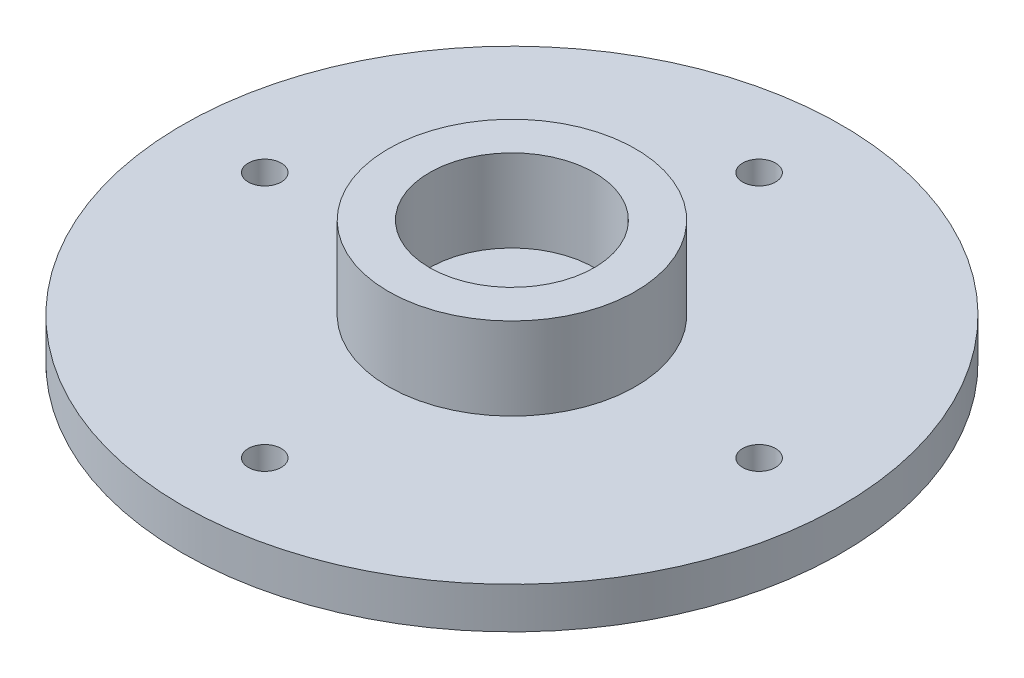
ISO-10303-21;
HEADER;
FILE_DESCRIPTION(('STEP AP214'),'2;1');
FILE_NAME('part.step','',(''),(''),'','','');
FILE_SCHEMA(('AUTOMOTIVE_DESIGN { 1 0 10303 214 1 1 1 1 }'));
ENDSEC;
DATA;
#1=APPLICATION_CONTEXT('core data for automotive mechanical design processes');
#2=APPLICATION_PROTOCOL_DEFINITION('international standard','automotive_design',2000,#1);
#3=PRODUCT_CONTEXT('',#1,'mechanical');
#4=PRODUCT('Part','Part','',(#3));
#5=PRODUCT_RELATED_PRODUCT_CATEGORY('part','',(#4));
#6=PRODUCT_DEFINITION_FORMATION('','',#4);
#7=PRODUCT_DEFINITION_CONTEXT('part definition',#1,'design');
#8=PRODUCT_DEFINITION('design','',#6,#7);
#9=PRODUCT_DEFINITION_SHAPE('','',#8);
#10=(LENGTH_UNIT() NAMED_UNIT(*) SI_UNIT(.MILLI.,.METRE.));
#11=(NAMED_UNIT(*) PLANE_ANGLE_UNIT() SI_UNIT($,.RADIAN.));
#12=(NAMED_UNIT(*) SI_UNIT($,.STERADIAN.) SOLID_ANGLE_UNIT());
#13=UNCERTAINTY_MEASURE_WITH_UNIT(LENGTH_MEASURE(1.E-05),#10,'distance_accuracy_value','');
#14=(GEOMETRIC_REPRESENTATION_CONTEXT(3) GLOBAL_UNCERTAINTY_ASSIGNED_CONTEXT((#13)) GLOBAL_UNIT_ASSIGNED_CONTEXT((#10,
#11,#12)) REPRESENTATION_CONTEXT('',''));
#15=CARTESIAN_POINT('',(0.,0.,0.));
#16=DIRECTION('',(0.,0.,1.));
#17=DIRECTION('',(1.,0.,0.));
#18=AXIS2_PLACEMENT_3D('',#15,#16,#17);
#19=CARTESIAN_POINT('',(0.,2.5,0.));
#20=DIRECTION('',(0.,1.,0.));
#21=DIRECTION('',(0.,0.,1.));
#22=AXIS2_PLACEMENT_3D('',#19,#20,#21);
#23=PLANE('',#22);
#24=CARTESIAN_POINT('',(0.,2.5,0.));
#25=DIRECTION('',(0.,1.,0.));
#26=DIRECTION('',(0.,0.,1.));
#27=AXIS2_PLACEMENT_3D('',#24,#25,#26);
#28=CIRCLE('',#27,15.);
#29=CARTESIAN_POINT('',(0.,2.5,15.));
#30=VERTEX_POINT('',#29);
#31=EDGE_CURVE('E85',#30,#30,#28,.T.);
#32=ORIENTED_EDGE('',*,*,#31,.F.);
#33=EDGE_LOOP('',(#32));
#34=FACE_BOUND('',#33,.T.);
#35=CARTESIAN_POINT('',(1.69428074463191E-12,2.5,30.));
#36=DIRECTION('',(0.,1.,0.));
#37=DIRECTION('',(0.,0.,1.));
#38=AXIS2_PLACEMENT_3D('',#35,#36,#37);
#39=CIRCLE('',#38,2.00000000000182);
#40=CARTESIAN_POINT('',(1.69428074463191E-12,2.5,32.0000000000018));
#41=VERTEX_POINT('',#40);
#42=EDGE_CURVE('E70',#41,#41,#39,.T.);
#43=ORIENTED_EDGE('',*,*,#42,.F.);
#44=EDGE_LOOP('',(#43));
#45=FACE_BOUND('',#44,.T.);
#46=CARTESIAN_POINT('',(0.,2.5,-30.));
#47=DIRECTION('',(0.,1.,0.));
#48=DIRECTION('',(0.,0.,1.));
#49=AXIS2_PLACEMENT_3D('',#46,#47,#48);
#50=CIRCLE('',#49,2.);
#51=CARTESIAN_POINT('',(0.,2.5,-28.));
#52=VERTEX_POINT('',#51);
#53=EDGE_CURVE('E59',#52,#52,#50,.T.);
#54=ORIENTED_EDGE('',*,*,#53,.F.);
#55=EDGE_LOOP('',(#54));
#56=FACE_BOUND('',#55,.T.);
#57=CARTESIAN_POINT('',(0.,2.5,0.));
#58=DIRECTION('',(0.,1.,0.));
#59=DIRECTION('',(0.,0.,1.));
#60=AXIS2_PLACEMENT_3D('',#57,#58,#59);
#61=CIRCLE('',#60,40.);
#62=CARTESIAN_POINT('',(0.,2.5,40.));
#63=VERTEX_POINT('',#62);
#64=EDGE_CURVE('E50',#63,#63,#61,.T.);
#65=ORIENTED_EDGE('',*,*,#64,.T.);
#66=EDGE_LOOP('',(#65));
#67=FACE_BOUND('',#66,.T.);
#68=CARTESIAN_POINT('',(30.0000000000008,2.5,-8.47140372315957E-13));
#69=DIRECTION('',(0.,1.,0.));
#70=DIRECTION('',(0.,0.,1.));
#71=AXIS2_PLACEMENT_3D('',#68,#69,#70);
#72=CIRCLE('',#71,2.00000000000066);
#73=CARTESIAN_POINT('',(30.0000000000008,2.5,1.99999999999982));
#74=VERTEX_POINT('',#73);
#75=EDGE_CURVE('E64',#74,#74,#72,.T.);
#76=ORIENTED_EDGE('',*,*,#75,.F.);
#77=EDGE_LOOP('',(#76));
#78=FACE_BOUND('',#77,.T.);
#79=CARTESIAN_POINT('',(-29.9999999999992,2.5,8.43466431918515E-13));
#80=DIRECTION('',(0.,1.,0.));
#81=DIRECTION('',(0.,0.,1.));
#82=AXIS2_PLACEMENT_3D('',#79,#80,#81);
#83=CIRCLE('',#82,2.00000000000135);
#84=CARTESIAN_POINT('',(-29.9999999999992,2.5,2.0000000000022));
#85=VERTEX_POINT('',#84);
#86=EDGE_CURVE('E76',#85,#85,#83,.T.);
#87=ORIENTED_EDGE('',*,*,#86,.F.);
#88=EDGE_LOOP('',(#87));
#89=FACE_BOUND('',#88,.T.);
#90=ADVANCED_FACE('F43',(#34,#45,#56,#67,#78,#89),#23,.T.);
#91=CARTESIAN_POINT('',(0.,-2.5,0.));
#92=DIRECTION('',(0.,1.,0.));
#93=DIRECTION('',(0.,0.,1.));
#94=AXIS2_PLACEMENT_3D('',#91,#92,#93);
#95=PLANE('',#94);
#96=CARTESIAN_POINT('',(0.,-2.5,0.));
#97=DIRECTION('',(0.,1.,0.));
#98=DIRECTION('',(0.,0.,1.));
#99=AXIS2_PLACEMENT_3D('',#96,#97,#98);
#100=CIRCLE('',#99,40.);
#101=CARTESIAN_POINT('',(0.,-2.5,40.));
#102=VERTEX_POINT('',#101);
#103=EDGE_CURVE('E54',#102,#102,#100,.T.);
#104=ORIENTED_EDGE('',*,*,#103,.F.);
#105=EDGE_LOOP('',(#104));
#106=FACE_BOUND('',#105,.T.);
#107=CARTESIAN_POINT('',(0.,-2.5,-30.));
#108=DIRECTION('',(0.,1.,0.));
#109=DIRECTION('',(0.,0.,1.));
#110=AXIS2_PLACEMENT_3D('',#107,#108,#109);
#111=CIRCLE('',#110,2.);
#112=CARTESIAN_POINT('',(0.,-2.5,-28.));
#113=VERTEX_POINT('',#112);
#114=EDGE_CURVE('E61',#113,#113,#111,.T.);
#115=ORIENTED_EDGE('',*,*,#114,.T.);
#116=EDGE_LOOP('',(#115));
#117=FACE_BOUND('',#116,.T.);
#118=CARTESIAN_POINT('',(30.0000000000008,-2.5,-8.47140372315957E-13));
#119=DIRECTION('',(0.,1.,0.));
#120=DIRECTION('',(0.,0.,1.));
#121=AXIS2_PLACEMENT_3D('',#118,#119,#120);
#122=CIRCLE('',#121,2.00000000000066);
#123=CARTESIAN_POINT('',(30.0000000000008,-2.5,1.99999999999982));
#124=VERTEX_POINT('',#123);
#125=EDGE_CURVE('E67',#124,#124,#122,.T.);
#126=ORIENTED_EDGE('',*,*,#125,.T.);
#127=EDGE_LOOP('',(#126));
#128=FACE_BOUND('',#127,.T.);
#129=CARTESIAN_POINT('',(1.69428074463191E-12,-2.5,30.));
#130=DIRECTION('',(0.,1.,0.));
#131=DIRECTION('',(0.,0.,1.));
#132=AXIS2_PLACEMENT_3D('',#129,#130,#131);
#133=CIRCLE('',#132,2.00000000000182);
#134=CARTESIAN_POINT('',(1.69428074463191E-12,-2.5,32.0000000000018));
#135=VERTEX_POINT('',#134);
#136=EDGE_CURVE('E73',#135,#135,#133,.T.);
#137=ORIENTED_EDGE('',*,*,#136,.T.);
#138=EDGE_LOOP('',(#137));
#139=FACE_BOUND('',#138,.T.);
#140=CARTESIAN_POINT('',(-29.9999999999992,-2.5,8.43466431918515E-13));
#141=DIRECTION('',(0.,1.,0.));
#142=DIRECTION('',(0.,0.,1.));
#143=AXIS2_PLACEMENT_3D('',#140,#141,#142);
#144=CIRCLE('',#143,2.00000000000135);
#145=CARTESIAN_POINT('',(-29.9999999999992,-2.5,2.0000000000022));
#146=VERTEX_POINT('',#145);
#147=EDGE_CURVE('E79',#146,#146,#144,.T.);
#148=ORIENTED_EDGE('',*,*,#147,.T.);
#149=EDGE_LOOP('',(#148));
#150=FACE_BOUND('',#149,.T.);
#151=ADVANCED_FACE('F113',(#106,#117,#128,#139,#150),#95,.F.);
#152=CARTESIAN_POINT('',(0.,2.5,0.));
#153=DIRECTION('',(0.,-1.,0.));
#154=DIRECTION('',(0.,0.,-1.));
#155=AXIS2_PLACEMENT_3D('',#152,#153,#154);
#156=CYLINDRICAL_SURFACE('',#155,40.);
#157=ORIENTED_EDGE('',*,*,#64,.F.);
#158=EDGE_LOOP('',(#157));
#159=FACE_BOUND('',#158,.T.);
#160=ORIENTED_EDGE('',*,*,#103,.T.);
#161=EDGE_LOOP('',(#160));
#162=FACE_BOUND('',#161,.T.);
#163=ADVANCED_FACE('F45',(#159,#162),#156,.T.);
#164=CARTESIAN_POINT('',(0.,2.5,-30.));
#165=DIRECTION('',(0.,-1.,0.));
#166=DIRECTION('',(0.,0.,-1.));
#167=AXIS2_PLACEMENT_3D('',#164,#165,#166);
#168=CYLINDRICAL_SURFACE('',#167,2.);
#169=ORIENTED_EDGE('',*,*,#53,.T.);
#170=EDGE_LOOP('',(#169));
#171=FACE_BOUND('',#170,.T.);
#172=ORIENTED_EDGE('',*,*,#114,.F.);
#173=EDGE_LOOP('',(#172));
#174=FACE_BOUND('',#173,.T.);
#175=ADVANCED_FACE('F170',(#171,#174),#168,.F.);
#176=CARTESIAN_POINT('',(30.0000000000008,2.5,-8.47140372315957E-13));
#177=DIRECTION('',(0.,-1.,0.));
#178=DIRECTION('',(0.,0.,-1.));
#179=AXIS2_PLACEMENT_3D('',#176,#177,#178);
#180=CYLINDRICAL_SURFACE('',#179,2.00000000000066);
#181=ORIENTED_EDGE('',*,*,#75,.T.);
#182=EDGE_LOOP('',(#181));
#183=FACE_BOUND('',#182,.T.);
#184=ORIENTED_EDGE('',*,*,#125,.F.);
#185=EDGE_LOOP('',(#184));
#186=FACE_BOUND('',#185,.T.);
#187=ADVANCED_FACE('F160',(#183,#186),#180,.F.);
#188=CARTESIAN_POINT('',(1.69428074463191E-12,2.5,30.));
#189=DIRECTION('',(0.,-1.,0.));
#190=DIRECTION('',(0.,0.,-1.));
#191=AXIS2_PLACEMENT_3D('',#188,#189,#190);
#192=CYLINDRICAL_SURFACE('',#191,2.00000000000182);
#193=ORIENTED_EDGE('',*,*,#42,.T.);
#194=EDGE_LOOP('',(#193));
#195=FACE_BOUND('',#194,.T.);
#196=ORIENTED_EDGE('',*,*,#136,.F.);
#197=EDGE_LOOP('',(#196));
#198=FACE_BOUND('',#197,.T.);
#199=ADVANCED_FACE('F109',(#195,#198),#192,.F.);
#200=CARTESIAN_POINT('',(-29.9999999999992,2.5,8.43466431918515E-13));
#201=DIRECTION('',(0.,-1.,0.));
#202=DIRECTION('',(0.,0.,-1.));
#203=AXIS2_PLACEMENT_3D('',#200,#201,#202);
#204=CYLINDRICAL_SURFACE('',#203,2.00000000000135);
#205=ORIENTED_EDGE('',*,*,#86,.T.);
#206=EDGE_LOOP('',(#205));
#207=FACE_BOUND('',#206,.T.);
#208=ORIENTED_EDGE('',*,*,#147,.F.);
#209=EDGE_LOOP('',(#208));
#210=FACE_BOUND('',#209,.T.);
#211=ADVANCED_FACE('F99',(#207,#210),#204,.F.);
#212=CARTESIAN_POINT('',(0.,12.5,0.));
#213=DIRECTION('',(0.,1.,0.));
#214=DIRECTION('',(0.,0.,1.));
#215=AXIS2_PLACEMENT_3D('',#212,#213,#214);
#216=PLANE('',#215);
#217=CARTESIAN_POINT('',(0.,12.5,0.));
#218=DIRECTION('',(0.,1.,0.));
#219=DIRECTION('',(0.,0.,1.));
#220=AXIS2_PLACEMENT_3D('',#217,#218,#219);
#221=CIRCLE('',#220,15.);
#222=CARTESIAN_POINT('',(0.,12.5,15.));
#223=VERTEX_POINT('',#222);
#224=EDGE_CURVE('E82',#223,#223,#221,.T.);
#225=ORIENTED_EDGE('',*,*,#224,.T.);
#226=EDGE_LOOP('',(#225));
#227=FACE_BOUND('',#226,.T.);
#228=CARTESIAN_POINT('',(0.,12.5,0.));
#229=DIRECTION('',(0.,1.,0.));
#230=DIRECTION('',(0.,0.,1.));
#231=AXIS2_PLACEMENT_3D('',#228,#229,#230);
#232=CIRCLE('',#231,10.);
#233=CARTESIAN_POINT('',(0.,12.5,10.));
#234=VERTEX_POINT('',#233);
#235=EDGE_CURVE('E88',#234,#234,#232,.T.);
#236=ORIENTED_EDGE('',*,*,#235,.F.);
#237=EDGE_LOOP('',(#236));
#238=FACE_BOUND('',#237,.T.);
#239=ADVANCED_FACE('F96',(#227,#238),#216,.T.);
#240=CARTESIAN_POINT('',(0.,12.5,0.));
#241=DIRECTION('',(0.,-1.,0.));
#242=DIRECTION('',(0.,0.,-1.));
#243=AXIS2_PLACEMENT_3D('',#240,#241,#242);
#244=CYLINDRICAL_SURFACE('',#243,15.);
#245=ORIENTED_EDGE('',*,*,#224,.F.);
#246=EDGE_LOOP('',(#245));
#247=FACE_BOUND('',#246,.T.);
#248=ORIENTED_EDGE('',*,*,#31,.T.);
#249=EDGE_LOOP('',(#248));
#250=FACE_BOUND('',#249,.T.);
#251=ADVANCED_FACE('F98',(#247,#250),#244,.T.);
#252=CARTESIAN_POINT('',(0.,12.5,0.));
#253=DIRECTION('',(0.,-1.,0.));
#254=DIRECTION('',(0.,0.,-1.));
#255=AXIS2_PLACEMENT_3D('',#252,#253,#254);
#256=CYLINDRICAL_SURFACE('',#255,10.);
#257=ORIENTED_EDGE('',*,*,#235,.T.);
#258=EDGE_LOOP('',(#257));
#259=FACE_BOUND('',#258,.T.);
#260=CARTESIAN_POINT('',(0.,2.5,0.));
#261=DIRECTION('',(0.,1.,0.));
#262=DIRECTION('',(0.,0.,1.));
#263=AXIS2_PLACEMENT_3D('',#260,#261,#262);
#264=CIRCLE('',#263,10.);
#265=CARTESIAN_POINT('',(0.,2.5,10.));
#266=VERTEX_POINT('',#265);
#267=EDGE_CURVE('E11',#266,#266,#264,.F.);
#268=ORIENTED_EDGE('',*,*,#267,.T.);
#269=EDGE_LOOP('',(#268));
#270=FACE_BOUND('',#269,.T.);
#271=ADVANCED_FACE('F94',(#259,#270),#256,.F.);
#272=ORIENTED_EDGE('',*,*,#267,.F.);
#273=EDGE_LOOP('',(#272));
#274=FACE_BOUND('',#273,.T.);
#275=ADVANCED_FACE('F116',(#274),#23,.T.);
#276=CLOSED_SHELL('',(#90,#151,#163,#175,#187,#199,#211,#239,#251,#271,#275));
#277=MANIFOLD_SOLID_BREP('B2',#276);
#278=ADVANCED_BREP_SHAPE_REPRESENTATION('',(#18,#277),#14);
#279=SHAPE_DEFINITION_REPRESENTATION(#9,#278);
ENDSEC;
END-ISO-10303-21;
